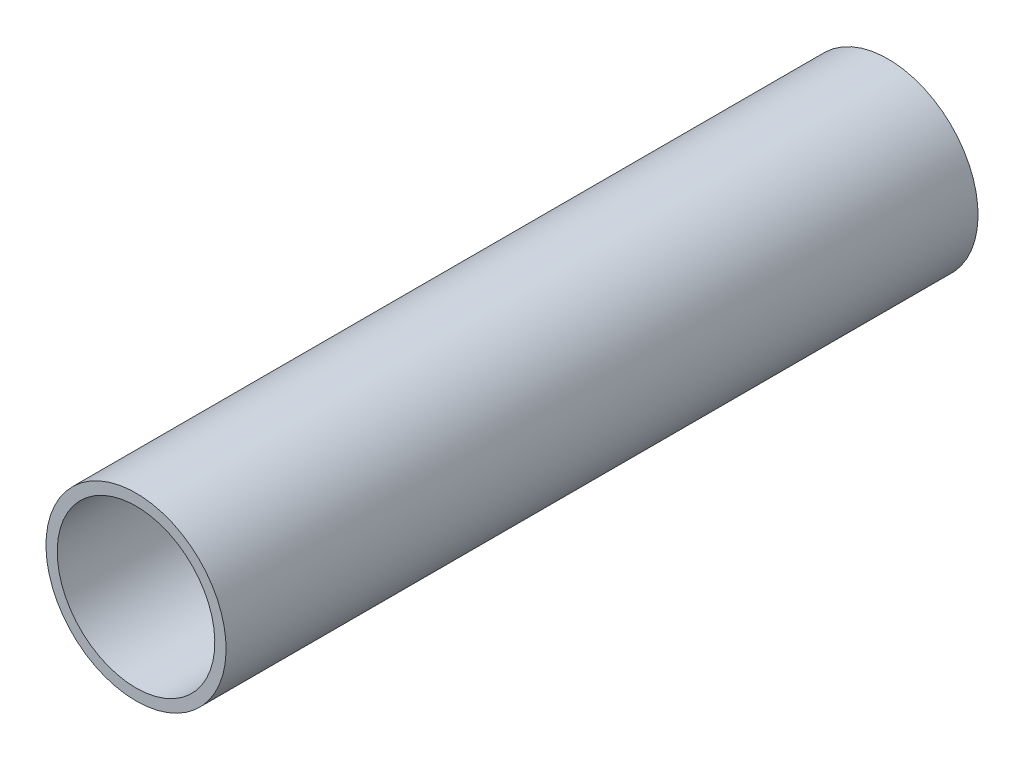
ISO-10303-21;
HEADER;
FILE_DESCRIPTION(('STEP AP214'),'2;1');
FILE_NAME('part.step','',(''),(''),'','','');
FILE_SCHEMA(('AUTOMOTIVE_DESIGN { 1 0 10303 214 1 1 1 1 }'));
ENDSEC;
DATA;
#1=APPLICATION_CONTEXT('core data for automotive mechanical design processes');
#2=APPLICATION_PROTOCOL_DEFINITION('international standard','automotive_design',2000,#1);
#3=PRODUCT_CONTEXT('',#1,'mechanical');
#4=PRODUCT('Part','Part','',(#3));
#5=PRODUCT_RELATED_PRODUCT_CATEGORY('part','',(#4));
#6=PRODUCT_DEFINITION_FORMATION('','',#4);
#7=PRODUCT_DEFINITION_CONTEXT('part definition',#1,'design');
#8=PRODUCT_DEFINITION('design','',#6,#7);
#9=PRODUCT_DEFINITION_SHAPE('','',#8);
#10=(LENGTH_UNIT() NAMED_UNIT(*) SI_UNIT(.MILLI.,.METRE.));
#11=(NAMED_UNIT(*) PLANE_ANGLE_UNIT() SI_UNIT($,.RADIAN.));
#12=(NAMED_UNIT(*) SI_UNIT($,.STERADIAN.) SOLID_ANGLE_UNIT());
#13=UNCERTAINTY_MEASURE_WITH_UNIT(LENGTH_MEASURE(1.E-05),#10,'distance_accuracy_value','');
#14=(GEOMETRIC_REPRESENTATION_CONTEXT(3) GLOBAL_UNCERTAINTY_ASSIGNED_CONTEXT((#13)) GLOBAL_UNIT_ASSIGNED_CONTEXT((#10,
#11,#12)) REPRESENTATION_CONTEXT('',''));
#15=CARTESIAN_POINT('',(0.,0.,0.));
#16=DIRECTION('',(0.,0.,1.));
#17=DIRECTION('',(1.,0.,0.));
#18=AXIS2_PLACEMENT_3D('',#15,#16,#17);
#19=CARTESIAN_POINT('',(97.66,-96.26,-0.045));
#20=DIRECTION('',(0.,0.,-1.));
#21=DIRECTION('',(0.,-1.,0.));
#22=AXIS2_PLACEMENT_3D('',#19,#20,#21);
#23=CYLINDRICAL_SURFACE('',#22,0.175);
#24=CARTESIAN_POINT('',(97.66,-96.26,-0.035));
#25=DIRECTION('',(0.,0.,-1.));
#26=DIRECTION('',(0.,-1.,0.));
#27=AXIS2_PLACEMENT_3D('',#24,#25,#26);
#28=CIRCLE('',#27,0.175);
#29=CARTESIAN_POINT('',(97.66,-96.435,-0.035));
#30=VERTEX_POINT('',#29);
#31=EDGE_CURVE('E64',#30,#30,#28,.T.);
#32=ORIENTED_EDGE('',*,*,#31,.T.);
#33=DIRECTION('',(0.,0.,1.));
#34=VECTOR('',#33,1.);
#35=CARTESIAN_POINT('',(97.66,-96.435,-0.045));
#36=LINE('',#35,#34);
#37=CARTESIAN_POINT('',(97.66,-96.435,1.635));
#38=VERTEX_POINT('',#37);
#39=EDGE_CURVE('E11',#30,#38,#36,.T.);
#40=ORIENTED_EDGE('',*,*,#39,.T.);
#41=CARTESIAN_POINT('',(97.66,-96.26,1.635));
#42=DIRECTION('',(0.,0.,-1.));
#43=DIRECTION('',(0.,-1.,0.));
#44=AXIS2_PLACEMENT_3D('',#41,#42,#43);
#45=CIRCLE('',#44,0.175);
#46=EDGE_CURVE('E25',#38,#38,#45,.T.);
#47=ORIENTED_EDGE('',*,*,#46,.F.);
#48=ORIENTED_EDGE('',*,*,#39,.F.);
#49=EDGE_LOOP('',(#32,#40,#47,#48));
#50=FACE_BOUND('',#49,.T.);
#51=ADVANCED_FACE('F17',(#50),#23,.F.);
#52=CARTESIAN_POINT('',(97.66,-96.46,1.635));
#53=DIRECTION('',(0.,0.,1.));
#54=DIRECTION('',(1.,0.,0.));
#55=AXIS2_PLACEMENT_3D('',#52,#53,#54);
#56=PLANE('',#55);
#57=ORIENTED_EDGE('',*,*,#46,.T.);
#58=EDGE_LOOP('',(#57));
#59=FACE_BOUND('',#58,.T.);
#60=CARTESIAN_POINT('',(97.66,-96.26,1.635));
#61=DIRECTION('',(0.,0.,1.));
#62=DIRECTION('',(0.,-1.,0.));
#63=AXIS2_PLACEMENT_3D('',#60,#61,#62);
#64=CIRCLE('',#63,0.2);
#65=CARTESIAN_POINT('',(97.66,-96.46,1.635));
#66=VERTEX_POINT('',#65);
#67=EDGE_CURVE('E56',#66,#66,#64,.T.);
#68=ORIENTED_EDGE('',*,*,#67,.T.);
#69=EDGE_LOOP('',(#68));
#70=FACE_BOUND('',#69,.T.);
#71=ADVANCED_FACE('F73',(#59,#70),#56,.T.);
#72=CARTESIAN_POINT('',(97.66,-96.46,-0.035));
#73=DIRECTION('',(0.,0.,1.));
#74=DIRECTION('',(1.,0.,0.));
#75=AXIS2_PLACEMENT_3D('',#72,#73,#74);
#76=PLANE('',#75);
#77=ORIENTED_EDGE('',*,*,#31,.F.);
#78=EDGE_LOOP('',(#77));
#79=FACE_BOUND('',#78,.T.);
#80=CARTESIAN_POINT('',(97.66,-96.26,-0.035));
#81=DIRECTION('',(0.,0.,1.));
#82=DIRECTION('',(0.,-1.,0.));
#83=AXIS2_PLACEMENT_3D('',#80,#81,#82);
#84=CIRCLE('',#83,0.2);
#85=CARTESIAN_POINT('',(97.66,-96.46,-0.035));
#86=VERTEX_POINT('',#85);
#87=EDGE_CURVE('E55',#86,#86,#84,.T.);
#88=ORIENTED_EDGE('',*,*,#87,.F.);
#89=EDGE_LOOP('',(#88));
#90=FACE_BOUND('',#89,.T.);
#91=ADVANCED_FACE('F82',(#79,#90),#76,.F.);
#92=CARTESIAN_POINT('',(97.66,-96.26,-0.035));
#93=DIRECTION('',(0.,0.,-1.));
#94=DIRECTION('',(0.,-1.,0.));
#95=AXIS2_PLACEMENT_3D('',#92,#93,#94);
#96=CYLINDRICAL_SURFACE('',#95,0.2);
#97=ORIENTED_EDGE('',*,*,#87,.T.);
#98=DIRECTION('',(0.,0.,1.));
#99=VECTOR('',#98,1.);
#100=CARTESIAN_POINT('',(97.66,-96.46,-0.035));
#101=LINE('',#100,#99);
#102=EDGE_CURVE('E52',#86,#66,#101,.T.);
#103=ORIENTED_EDGE('',*,*,#102,.T.);
#104=ORIENTED_EDGE('',*,*,#67,.F.);
#105=ORIENTED_EDGE('',*,*,#102,.F.);
#106=EDGE_LOOP('',(#97,#103,#104,#105));
#107=FACE_BOUND('',#106,.T.);
#108=ADVANCED_FACE('F53',(#107),#96,.T.);
#109=CLOSED_SHELL('',(#51,#71,#91,#108));
#110=MANIFOLD_SOLID_BREP('B1',#109);
#111=ADVANCED_BREP_SHAPE_REPRESENTATION('',(#18,#110),#14);
#112=SHAPE_DEFINITION_REPRESENTATION(#9,#111);
ENDSEC;
END-ISO-10303-21;
